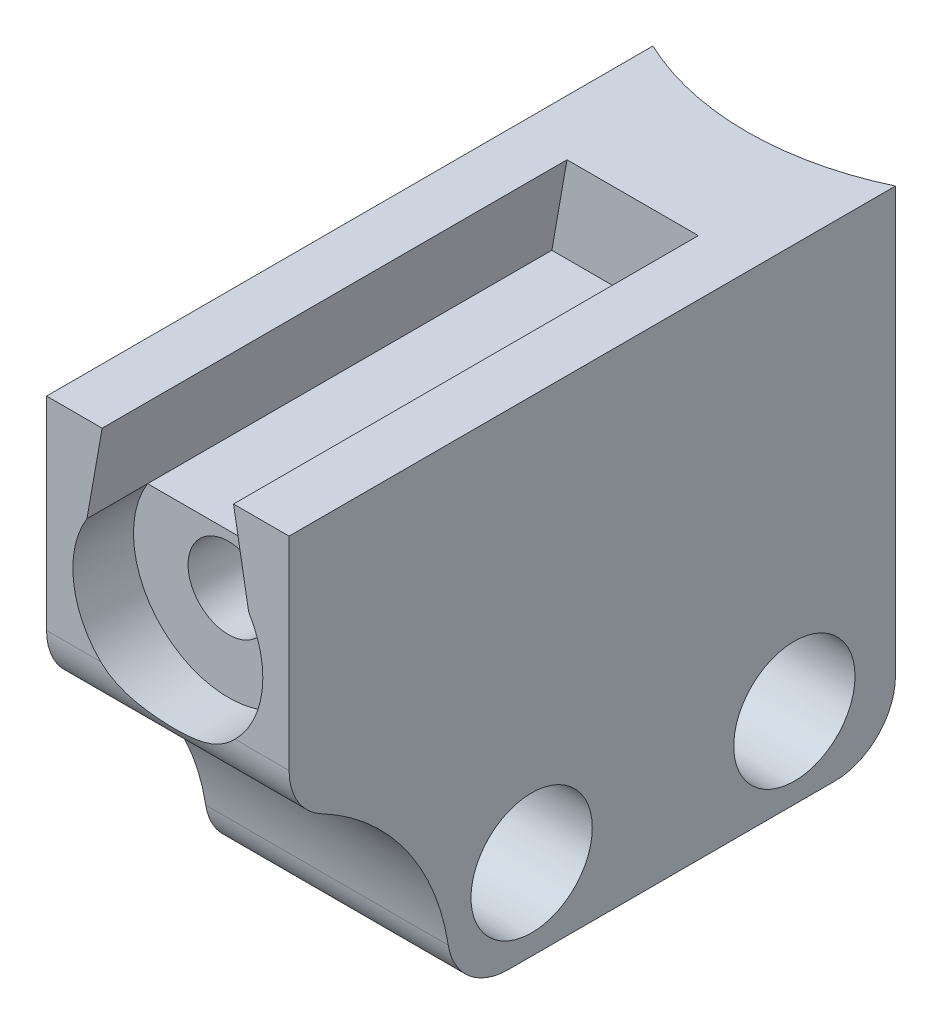
ISO-10303-21;
HEADER;
FILE_DESCRIPTION(('STEP AP214'),'2;1');
FILE_NAME('part.step','',(''),(''),'','','');
FILE_SCHEMA(('AUTOMOTIVE_DESIGN { 1 0 10303 214 1 1 1 1 }'));
ENDSEC;
DATA;
#1=APPLICATION_CONTEXT('core data for automotive mechanical design processes');
#2=APPLICATION_PROTOCOL_DEFINITION('international standard','automotive_design',2000,#1);
#3=PRODUCT_CONTEXT('',#1,'mechanical');
#4=PRODUCT('Part','Part','',(#3));
#5=PRODUCT_RELATED_PRODUCT_CATEGORY('part','',(#4));
#6=PRODUCT_DEFINITION_FORMATION('','',#4);
#7=PRODUCT_DEFINITION_CONTEXT('part definition',#1,'design');
#8=PRODUCT_DEFINITION('design','',#6,#7);
#9=PRODUCT_DEFINITION_SHAPE('','',#8);
#10=(LENGTH_UNIT() NAMED_UNIT(*) SI_UNIT(.MILLI.,.METRE.));
#11=(NAMED_UNIT(*) PLANE_ANGLE_UNIT() SI_UNIT($,.RADIAN.));
#12=(NAMED_UNIT(*) SI_UNIT($,.STERADIAN.) SOLID_ANGLE_UNIT());
#13=UNCERTAINTY_MEASURE_WITH_UNIT(LENGTH_MEASURE(1.E-05),#10,'distance_accuracy_value','');
#14=(GEOMETRIC_REPRESENTATION_CONTEXT(3) GLOBAL_UNCERTAINTY_ASSIGNED_CONTEXT((#13)) GLOBAL_UNIT_ASSIGNED_CONTEXT((#10,
#11,#12)) REPRESENTATION_CONTEXT('',''));
#15=CARTESIAN_POINT('',(0.,0.,0.));
#16=DIRECTION('',(0.,0.,1.));
#17=DIRECTION('',(1.,0.,0.));
#18=AXIS2_PLACEMENT_3D('',#15,#16,#17);
#19=CARTESIAN_POINT('',(6.,12.,15.));
#20=DIRECTION('',(0.,-1.,0.));
#21=DIRECTION('',(0.,0.,-1.));
#22=AXIS2_PLACEMENT_3D('',#19,#20,#21);
#23=PLANE('',#22);
#24=CARTESIAN_POINT('',(0.,12.,-27.6491106406735));
#25=DIRECTION('',(0.,1.,0.));
#26=DIRECTION('',(0.,0.,1.));
#27=AXIS2_PLACEMENT_3D('',#24,#25,#26);
#28=CIRCLE('',#27,14.);
#29=CARTESIAN_POINT('',(-6.,12.,-15.));
#30=VERTEX_POINT('',#29);
#31=CARTESIAN_POINT('',(6.,12.,-15.));
#32=VERTEX_POINT('',#31);
#33=EDGE_CURVE('E147',#30,#32,#28,.T.);
#34=ORIENTED_EDGE('',*,*,#33,.F.);
#35=DIRECTION('',(0.,0.,1.));
#36=VECTOR('',#35,1.);
#37=CARTESIAN_POINT('',(-6.,12.,15.));
#38=LINE('',#37,#36);
#39=CARTESIAN_POINT('',(-6.,12.,15.));
#40=VERTEX_POINT('',#39);
#41=EDGE_CURVE('E156',#30,#40,#38,.T.);
#42=ORIENTED_EDGE('',*,*,#41,.T.);
#43=DIRECTION('',(-1.,0.,0.));
#44=VECTOR('',#43,1.);
#45=CARTESIAN_POINT('',(6.,12.,15.));
#46=LINE('',#45,#44);
#47=CARTESIAN_POINT('',(-3.25,12.,15.));
#48=VERTEX_POINT('',#47);
#49=EDGE_CURVE('E181',#48,#40,#46,.T.);
#50=ORIENTED_EDGE('',*,*,#49,.F.);
#51=DIRECTION('',(0.,0.,1.));
#52=VECTOR('',#51,1.);
#53=CARTESIAN_POINT('',(-3.25,12.,-8.));
#54=LINE('',#53,#52);
#55=CARTESIAN_POINT('',(-3.25,12.,-8.));
#56=VERTEX_POINT('',#55);
#57=EDGE_CURVE('E332',#56,#48,#54,.T.);
#58=ORIENTED_EDGE('',*,*,#57,.F.);
#59=DIRECTION('',(-1.,0.,0.));
#60=VECTOR('',#59,1.);
#61=CARTESIAN_POINT('',(0.,12.,-8.));
#62=LINE('',#61,#60);
#63=CARTESIAN_POINT('',(3.25,12.,-8.));
#64=VERTEX_POINT('',#63);
#65=EDGE_CURVE('E335',#64,#56,#62,.T.);
#66=ORIENTED_EDGE('',*,*,#65,.F.);
#67=DIRECTION('',(0.,0.,1.));
#68=VECTOR('',#67,1.);
#69=CARTESIAN_POINT('',(3.25,12.,-8.));
#70=LINE('',#69,#68);
#71=CARTESIAN_POINT('',(3.25,12.,15.));
#72=VERTEX_POINT('',#71);
#73=EDGE_CURVE('E319',#64,#72,#70,.T.);
#74=ORIENTED_EDGE('',*,*,#73,.T.);
#75=CARTESIAN_POINT('',(6.,12.,15.));
#76=VERTEX_POINT('',#75);
#77=EDGE_CURVE('E177',#76,#72,#46,.T.);
#78=ORIENTED_EDGE('',*,*,#77,.F.);
#79=DIRECTION('',(0.,0.,1.));
#80=VECTOR('',#79,1.);
#81=CARTESIAN_POINT('',(6.,12.,15.));
#82=LINE('',#81,#80);
#83=EDGE_CURVE('E164',#32,#76,#82,.T.);
#84=ORIENTED_EDGE('',*,*,#83,.F.);
#85=EDGE_LOOP('',(#34,#42,#50,#58,#66,#74,#78,#84));
#86=FACE_BOUND('',#85,.T.);
#87=ADVANCED_FACE('F39',(#86),#23,.F.);
#88=CARTESIAN_POINT('',(6.,12.,15.));
#89=DIRECTION('',(0.,0.,-1.));
#90=DIRECTION('',(0.,1.,0.));
#91=AXIS2_PLACEMENT_3D('',#88,#89,#90);
#92=PLANE('',#91);
#93=DIRECTION('',(-0.173648177666928,0.984807753012209,0.));
#94=VECTOR('',#93,1.);
#95=CARTESIAN_POINT('',(5.20412136873109,0.917627008188741,15.));
#96=LINE('',#95,#94);
#97=CARTESIAN_POINT('',(4.,7.74653863528664,15.));
#98=VERTEX_POINT('',#97);
#99=EDGE_CURVE('E501',#98,#72,#96,.T.);
#100=ORIENTED_EDGE('',*,*,#99,.F.);
#101=CARTESIAN_POINT('',(0.,5.27874609943603,15.));
#102=DIRECTION('',(0.,0.,1.));
#103=DIRECTION('',(1.,0.,0.));
#104=AXIS2_PLACEMENT_3D('',#101,#102,#103);
#105=CIRCLE('',#104,4.7);
#106=CARTESIAN_POINT('',(3.32420063272804,1.95614318103448,15.));
#107=VERTEX_POINT('',#106);
#108=EDGE_CURVE('E249',#107,#98,#105,.T.);
#109=ORIENTED_EDGE('',*,*,#108,.F.);
#110=DIRECTION('',(-1.,0.,0.));
#111=VECTOR('',#110,1.);
#112=CARTESIAN_POINT('',(6.,1.95614318103448,15.));
#113=LINE('',#112,#111);
#114=CARTESIAN_POINT('',(6.,1.95614318103449,15.));
#115=VERTEX_POINT('',#114);
#116=EDGE_CURVE('E206',#107,#115,#113,.F.);
#117=ORIENTED_EDGE('',*,*,#116,.T.);
#118=DIRECTION('',(0.,-1.,0.));
#119=VECTOR('',#118,1.);
#120=CARTESIAN_POINT('',(6.,12.,15.));
#121=LINE('',#120,#119);
#122=EDGE_CURVE('E175',#76,#115,#121,.T.);
#123=ORIENTED_EDGE('',*,*,#122,.F.);
#124=ORIENTED_EDGE('',*,*,#77,.T.);
#125=EDGE_LOOP('',(#100,#109,#117,#123,#124));
#126=FACE_BOUND('',#125,.T.);
#127=ADVANCED_FACE('F238',(#126),#92,.F.);
#128=CARTESIAN_POINT('',(0.,5.27874609943603,-15.));
#129=DIRECTION('',(0.,0.,1.));
#130=DIRECTION('',(1.,0.,0.));
#131=AXIS2_PLACEMENT_3D('',#128,#129,#130);
#132=CYLINDRICAL_SURFACE('',#131,2.);
#133=CARTESIAN_POINT('',(2.,5.27874609943603,-13.7927041801225));
#134=CARTESIAN_POINT('',(1.99999534115949,5.16702192819631,-13.792702383547));
#135=CARTESIAN_POINT('',(1.99060664506871,5.05523138666387,-13.7913383209474));
#136=CARTESIAN_POINT('',(1.95330740137887,4.83477146301273,-13.7860326493668));
#137=CARTESIAN_POINT('',(1.92537839621705,4.72610530392088,-13.7820884718432));
#138=CARTESIAN_POINT('',(1.85184738836467,4.51511739940718,-13.7720782142411));
#139=CARTESIAN_POINT('',(1.80625847122079,4.41279102133551,-13.7660137055976));
#140=CARTESIAN_POINT('',(1.69873175889211,4.21725636996797,-13.7524479746925));
#141=CARTESIAN_POINT('',(1.63679637900725,4.12404675239574,-13.7449469647284));
#142=CARTESIAN_POINT('',(1.49785346840196,3.9486978035887,-13.729292388118));
#143=CARTESIAN_POINT('',(1.42075056427329,3.86663438557014,-13.7211348959462));
#144=CARTESIAN_POINT('',(1.25386707896715,3.71656454219545,-13.7051216094891));
#145=CARTESIAN_POINT('',(1.16408582185113,3.64855886679576,-13.6972658313179));
#146=CARTESIAN_POINT('',(0.973910384020492,3.52825700167635,-13.6827002704446));
#147=CARTESIAN_POINT('',(0.873471766216093,3.4760303849176,-13.6759956177388));
#148=CARTESIAN_POINT('',(0.665136745963097,3.38921536410821,-13.6645311261444));
#149=CARTESIAN_POINT('',(0.55724070203933,3.35462611278864,-13.6597711938371));
#150=CARTESIAN_POINT('',(0.337834063540952,3.30429689247176,-13.6527601405837));
#151=CARTESIAN_POINT('',(0.226353125069879,3.28843002946979,-13.6504921374924));
#152=CARTESIAN_POINT('',(0.00228956527839985,3.27560220086943,-13.6486626858352));
#153=CARTESIAN_POINT('',(-0.110292999940578,3.27864027746992,-13.6491011001512));
#154=CARTESIAN_POINT('',(-0.33249899218587,3.30343547765184,-13.6526215460409));
#155=CARTESIAN_POINT('',(-0.442137999771035,3.32505609831854,-13.6556842993492));
#156=CARTESIAN_POINT('',(-0.656215595128694,3.38618865913524,-13.6640877865472));
#157=CARTESIAN_POINT('',(-0.760654059261883,3.42570102442383,-13.6694285745666));
#158=CARTESIAN_POINT('',(-0.961781966767737,3.5216368442196,-13.6818212369637));
#159=CARTESIAN_POINT('',(-1.05844339279107,3.57811825055487,-13.6888789589564));
#160=CARTESIAN_POINT('',(-1.24096782013765,3.70634659217629,-13.7039179737112));
#161=CARTESIAN_POINT('',(-1.32683017541183,3.77809444007925,-13.711899321674));
#162=CARTESIAN_POINT('',(-1.48612299106386,3.93558070111202,-13.7279785912355));
#163=CARTESIAN_POINT('',(-1.55943569332184,4.02143823218522,-13.7360769175612));
#164=CARTESIAN_POINT('',(-1.69062989590123,4.20430062086551,-13.7514077019169));
#165=CARTESIAN_POINT('',(-1.74851131716178,4.30130553558164,-13.7586401555105));
#166=CARTESIAN_POINT('',(-1.84721301520795,4.50382638934221,-13.7714201038443));
#167=CARTESIAN_POINT('',(-1.88802200251778,4.60934790531863,-13.7769664829749));
#168=CARTESIAN_POINT('',(-1.9513062370832,4.82584367926192,-13.785725982584));
#169=CARTESIAN_POINT('',(-1.97378265080302,4.93681758982759,-13.7889392515123));
#170=CARTESIAN_POINT('',(-1.99960390688194,5.16002263686607,-13.7926408331003));
#171=CARTESIAN_POINT('',(-2.00311531104472,5.27223412543161,-13.7931528686425));
#172=CARTESIAN_POINT('',(-1.9913480824712,5.49564390446118,-13.7914569153464));
#173=CARTESIAN_POINT('',(-1.9760699768337,5.60684222325932,-13.7892490028104));
#174=CARTESIAN_POINT('',(-1.92729837855201,5.82455827946448,-13.7823836754219));
#175=CARTESIAN_POINT('',(-1.8938871584442,5.93109482650137,-13.777737327221));
#176=CARTESIAN_POINT('',(-1.80988306171463,6.13705489689253,-13.7665277285518));
#177=CARTESIAN_POINT('',(-1.75928940970141,6.23647809899775,-13.7599643915774));
#178=CARTESIAN_POINT('',(-1.64195360331225,6.42613797915752,-13.7456041565393));
#179=CARTESIAN_POINT('',(-1.57510320027125,6.51630706064839,-13.7377991161505));
#180=CARTESIAN_POINT('',(-1.42730277821365,6.68420582306154,-13.7218597320143));
#181=CARTESIAN_POINT('',(-1.34635203820216,6.76193486749516,-13.7137253714441));
#182=CARTESIAN_POINT('',(-1.17191708628535,6.90334131786983,-13.6979701165344));
#183=CARTESIAN_POINT('',(-1.07834317212433,6.96690862175555,-13.690353545055));
#184=CARTESIAN_POINT('',(-0.881748704771192,7.07742166257175,-13.6765584250755));
#185=CARTESIAN_POINT('',(-0.778728390176453,7.12436781917398,-13.6703798402686));
#186=CARTESIAN_POINT('',(-0.56651592459393,7.20012821375175,-13.6601758622291));
#187=CARTESIAN_POINT('',(-0.457345999123926,7.22900368806352,-13.6561432041013));
#188=CARTESIAN_POINT('',(-0.235645259045783,7.26800156654264,-13.6506550495083));
#189=CARTESIAN_POINT('',(-0.123114645314276,7.27812508928988,-13.6491993993212));
#190=CARTESIAN_POINT('',(0.101043130627158,7.2793063383805,-13.6490305639544));
#191=CARTESIAN_POINT('',(0.212669421750585,7.27053291845447,-13.6502930904496));
#192=CARTESIAN_POINT('',(0.432842633479873,7.234529949393,-13.6553699979231));
#193=CARTESIAN_POINT('',(0.541389561355443,7.20730044383216,-13.6591843728765));
#194=CARTESIAN_POINT('',(0.752283714497252,7.13521612200783,-13.668938420131));
#195=CARTESIAN_POINT('',(0.854634630206986,7.09037191895129,-13.6748768124769));
#196=CARTESIAN_POINT('',(1.05038570585148,6.984348950234,-13.6882250396506));
#197=CARTESIAN_POINT('',(1.14378562996655,6.92316975437792,-13.6956349132297));
#198=CARTESIAN_POINT('',(1.31984194960265,6.78559838421266,-13.7111801660389));
#199=CARTESIAN_POINT('',(1.40240016631986,6.70908119260353,-13.7193211820832));
#200=CARTESIAN_POINT('',(1.55356716727243,6.54326853920073,-13.7353684064114));
#201=CARTESIAN_POINT('',(1.6221726663073,6.4539700764395,-13.7432745590229));
#202=CARTESIAN_POINT('',(1.74379523475593,6.26460066110038,-13.7579997621562));
#203=CARTESIAN_POINT('',(1.79673154300995,6.16447740902491,-13.7648131004009));
#204=CARTESIAN_POINT('',(1.88495902507096,5.95671380283151,-13.7765143593141));
#205=CARTESIAN_POINT('',(1.92026877922144,5.84908150111884,-13.7814043062919));
#206=CARTESIAN_POINT('',(1.96409255165575,5.66390967360549,-13.7875577184963));
#207=CARTESIAN_POINT('',(1.97753762529532,5.58752176402547,-13.7894776007796));
#208=CARTESIAN_POINT('',(1.99549291508544,5.4336819024702,-13.7920514475105));
#209=CARTESIAN_POINT('',(2.00000323103726,5.35622996238991,-13.7927054260983));
#210=CARTESIAN_POINT('',(2.,5.27874609943603,-13.7927041801225));
#211=B_SPLINE_CURVE_WITH_KNOTS('',3,(#133,#134,#135,#136,#137,#138,#139,#140,#141,#142,#143,
#144,#145,#146,#147,#148,#149,#150,#151,#152,#153,#154,#155,#156,#157,#158,#159,#160,#161,#162,
#163,#164,#165,#166,#167,#168,#169,#170,#171,#172,#173,#174,#175,#176,#177,#178,#179,#180,#181,
#182,#183,#184,#185,#186,#187,#188,#189,#190,#191,#192,#193,#194,#195,#196,#197,#198,#199,#200,
#201,#202,#203,#204,#205,#206,#207,#208,#209,#210),.UNSPECIFIED.,.T.,.F.,(4,2,2,2,2,2,2,2,2,2,2,
2,2,2,2,2,2,2,2,2,2,2,2,2,2,2,2,2,2,2,2,2,2,2,2,2,2,2,4),(0.,0.334889349408973,
0.670112594526281,1.00508792139358,1.34001378108308,1.6771171564902,2.01423851114537,
2.35282530676003,2.6913958357102,3.02765822138618,3.36390357078099,3.69769984907442,
4.03150405935711,4.36646147641387,4.70143892261039,5.03940517986243,5.37737316862278,
5.7155642933107,6.05373389790875,6.3889286108256,6.72411392079905,7.05779100804298,
7.39148315513125,7.72746121011463,8.06345644976601,8.40197921522166,8.74049343261658,
9.07785422138908,9.41519488547502,9.74953375304065,10.083871831239,10.4180087723112,
10.7521545140199,11.0891434930866,11.426211725383,11.7649881551453,12.103406718889,
12.3356645196522,12.5679197260806),.UNSPECIFIED.);
#212=CARTESIAN_POINT('',(2.,5.27874609943603,-13.7927041801225));
#213=VERTEX_POINT('',#212);
#214=EDGE_CURVE('E167',#213,#213,#211,.T.);
#215=ORIENTED_EDGE('',*,*,#214,.T.);
#216=EDGE_LOOP('',(#215));
#217=FACE_BOUND('',#216,.T.);
#218=CARTESIAN_POINT('',(0.,5.27874609943603,12.));
#219=DIRECTION('',(0.,0.,1.));
#220=DIRECTION('',(1.,0.,0.));
#221=AXIS2_PLACEMENT_3D('',#218,#219,#220);
#222=CIRCLE('',#221,2.);
#223=CARTESIAN_POINT('',(2.,5.27874609943603,12.));
#224=VERTEX_POINT('',#223);
#225=EDGE_CURVE('E509',#224,#224,#222,.T.);
#226=ORIENTED_EDGE('',*,*,#225,.T.);
#227=EDGE_LOOP('',(#226));
#228=FACE_BOUND('',#227,.T.);
#229=ADVANCED_FACE('F234',(#217,#228),#132,.F.);
#230=CARTESIAN_POINT('',(-6.,1.95614318103449,15.));
#231=VERTEX_POINT('',#230);
#232=CARTESIAN_POINT('',(-3.32420063272804,1.95614318103448,15.));
#233=VERTEX_POINT('',#232);
#234=EDGE_CURVE('E210',#231,#233,#113,.F.);
#235=ORIENTED_EDGE('',*,*,#234,.T.);
#236=CARTESIAN_POINT('',(-4.,7.74653863528664,15.));
#237=VERTEX_POINT('',#236);
#238=EDGE_CURVE('E61',#237,#233,#105,.T.);
#239=ORIENTED_EDGE('',*,*,#238,.F.);
#240=DIRECTION('',(-0.173648177666927,-0.984807753012209,0.));
#241=VECTOR('',#240,1.);
#242=CARTESIAN_POINT('',(-5.20412136873108,0.917627008188738,15.));
#243=LINE('',#242,#241);
#244=EDGE_CURVE('E328',#48,#237,#243,.T.);
#245=ORIENTED_EDGE('',*,*,#244,.F.);
#246=ORIENTED_EDGE('',*,*,#49,.T.);
#247=DIRECTION('',(0.,-1.,0.));
#248=VECTOR('',#247,1.);
#249=CARTESIAN_POINT('',(-6.,12.,15.));
#250=LINE('',#249,#248);
#251=EDGE_CURVE('E171',#40,#231,#250,.T.);
#252=ORIENTED_EDGE('',*,*,#251,.T.);
#253=EDGE_LOOP('',(#235,#239,#245,#246,#252));
#254=FACE_BOUND('',#253,.T.);
#255=ADVANCED_FACE('F239',(#254),#92,.F.);
#256=CARTESIAN_POINT('',(6.,-11.3204973740894,18.9807460611341));
#257=DIRECTION('',(-1.,0.,0.));
#258=DIRECTION('',(0.,0.,1.));
#259=AXIS2_PLACEMENT_3D('',#256,#257,#258);
#260=PLANE('',#259);
#261=DIRECTION('',(0.,0.,-1.));
#262=VECTOR('',#261,1.);
#263=CARTESIAN_POINT('',(6.,-12.,7.));
#264=LINE('',#263,#262);
#265=CARTESIAN_POINT('',(6.,-12.,4.16132326748779));
#266=VERTEX_POINT('',#265);
#267=CARTESIAN_POINT('',(6.,-12.,-12.));
#268=VERTEX_POINT('',#267);
#269=EDGE_CURVE('E299',#266,#268,#264,.T.);
#270=ORIENTED_EDGE('',*,*,#269,.T.);
#271=CARTESIAN_POINT('',(6.,-9.,-12.));
#272=DIRECTION('',(-1.,0.,0.));
#273=DIRECTION('',(0.,0.,1.));
#274=AXIS2_PLACEMENT_3D('',#271,#272,#273);
#275=CIRCLE('',#274,3.);
#276=CARTESIAN_POINT('',(6.,-8.99999999999999,-15.));
#277=VERTEX_POINT('',#276);
#278=EDGE_CURVE('E196',#268,#277,#275,.F.);
#279=ORIENTED_EDGE('',*,*,#278,.T.);
#280=DIRECTION('',(0.,1.,0.));
#281=VECTOR('',#280,1.);
#282=CARTESIAN_POINT('',(6.,12.,-15.));
#283=LINE('',#282,#281);
#284=EDGE_CURVE('E308',#277,#32,#283,.T.);
#285=ORIENTED_EDGE('',*,*,#284,.T.);
#286=ORIENTED_EDGE('',*,*,#83,.T.);
#287=ORIENTED_EDGE('',*,*,#122,.T.);
#288=CARTESIAN_POINT('',(6.,1.95614318103448,12.));
#289=DIRECTION('',(-1.,0.,0.));
#290=DIRECTION('',(0.,0.,1.));
#291=AXIS2_PLACEMENT_3D('',#288,#289,#290);
#292=CIRCLE('',#291,3.);
#293=CARTESIAN_POINT('',(6.,-0.699184929990297,13.3961492122268));
#294=VERTEX_POINT('',#293);
#295=EDGE_CURVE('E192',#115,#294,#292,.F.);
#296=ORIENTED_EDGE('',*,*,#295,.T.);
#297=CARTESIAN_POINT('',(6.,-11.3204973740894,18.9807460611341));
#298=DIRECTION('',(-1.,0.,0.));
#299=DIRECTION('',(0.,0.,1.));
#300=AXIS2_PLACEMENT_3D('',#297,#298,#299);
#301=CIRCLE('',#300,12.);
#302=CARTESIAN_POINT('',(6.,-9.46409947481788,7.12520782621705));
#303=VERTEX_POINT('',#302);
#304=EDGE_CURVE('E174',#294,#303,#301,.T.);
#305=ORIENTED_EDGE('',*,*,#304,.T.);
#306=CARTESIAN_POINT('',(6.,-9.,4.16132326748779));
#307=DIRECTION('',(-1.,0.,0.));
#308=DIRECTION('',(0.,0.,1.));
#309=AXIS2_PLACEMENT_3D('',#306,#307,#308);
#310=CIRCLE('',#309,3.);
#311=EDGE_CURVE('E198',#303,#266,#310,.F.);
#312=ORIENTED_EDGE('',*,*,#311,.T.);
#313=EDGE_LOOP('',(#270,#279,#285,#286,#287,#296,#305,#312));
#314=FACE_BOUND('',#313,.T.);
#315=CARTESIAN_POINT('',(6.,-8.,3.));
#316=DIRECTION('',(1.,0.,0.));
#317=DIRECTION('',(0.,0.,-1.));
#318=AXIS2_PLACEMENT_3D('',#315,#316,#317);
#319=CIRCLE('',#318,3.);
#320=CARTESIAN_POINT('',(6.,-8.,0.));
#321=VERTEX_POINT('',#320);
#322=EDGE_CURVE('E314',#321,#321,#319,.T.);
#323=ORIENTED_EDGE('',*,*,#322,.F.);
#324=EDGE_LOOP('',(#323));
#325=FACE_BOUND('',#324,.T.);
#326=CARTESIAN_POINT('',(6.,-7.99999999999999,-10.));
#327=DIRECTION('',(1.,0.,0.));
#328=DIRECTION('',(0.,0.,-1.));
#329=AXIS2_PLACEMENT_3D('',#326,#327,#328);
#330=CIRCLE('',#329,3.);
#331=CARTESIAN_POINT('',(6.,-7.99999999999999,-13.));
#332=VERTEX_POINT('',#331);
#333=EDGE_CURVE('E347',#332,#332,#330,.T.);
#334=ORIENTED_EDGE('',*,*,#333,.F.);
#335=EDGE_LOOP('',(#334));
#336=FACE_BOUND('',#335,.T.);
#337=ADVANCED_FACE('F278',(#314,#325,#336),#260,.F.);
#338=CARTESIAN_POINT('',(-6.,-11.3204973740894,18.9807460611341));
#339=DIRECTION('',(-1.,0.,0.));
#340=DIRECTION('',(0.,0.,1.));
#341=AXIS2_PLACEMENT_3D('',#338,#339,#340);
#342=PLANE('',#341);
#343=CARTESIAN_POINT('',(-6.,-8.,3.));
#344=DIRECTION('',(1.,0.,0.));
#345=DIRECTION('',(0.,0.,-1.));
#346=AXIS2_PLACEMENT_3D('',#343,#344,#345);
#347=CIRCLE('',#346,3.);
#348=CARTESIAN_POINT('',(-6.,-8.,0.));
#349=VERTEX_POINT('',#348);
#350=EDGE_CURVE('E349',#349,#349,#347,.T.);
#351=ORIENTED_EDGE('',*,*,#350,.T.);
#352=EDGE_LOOP('',(#351));
#353=FACE_BOUND('',#352,.T.);
#354=DIRECTION('',(0.,1.,0.));
#355=VECTOR('',#354,1.);
#356=CARTESIAN_POINT('',(-6.,12.,-15.));
#357=LINE('',#356,#355);
#358=CARTESIAN_POINT('',(-6.,-9.,-15.));
#359=VERTEX_POINT('',#358);
#360=EDGE_CURVE('E148',#359,#30,#357,.T.);
#361=ORIENTED_EDGE('',*,*,#360,.F.);
#362=CARTESIAN_POINT('',(-6.,-9.,-12.));
#363=DIRECTION('',(-1.,0.,0.));
#364=DIRECTION('',(0.,0.,1.));
#365=AXIS2_PLACEMENT_3D('',#362,#363,#364);
#366=CIRCLE('',#365,3.);
#367=CARTESIAN_POINT('',(-6.,-12.,-12.));
#368=VERTEX_POINT('',#367);
#369=EDGE_CURVE('E190',#359,#368,#366,.T.);
#370=ORIENTED_EDGE('',*,*,#369,.T.);
#371=DIRECTION('',(0.,0.,-1.));
#372=VECTOR('',#371,1.);
#373=CARTESIAN_POINT('',(-6.,-12.,7.));
#374=LINE('',#373,#372);
#375=CARTESIAN_POINT('',(-6.,-12.,4.16132326748779));
#376=VERTEX_POINT('',#375);
#377=EDGE_CURVE('E160',#376,#368,#374,.T.);
#378=ORIENTED_EDGE('',*,*,#377,.F.);
#379=CARTESIAN_POINT('',(-6.,-9.,4.16132326748779));
#380=DIRECTION('',(-1.,0.,0.));
#381=DIRECTION('',(0.,0.,1.));
#382=AXIS2_PLACEMENT_3D('',#379,#380,#381);
#383=CIRCLE('',#382,3.);
#384=CARTESIAN_POINT('',(-6.,-9.46409947481788,7.12520782621705));
#385=VERTEX_POINT('',#384);
#386=EDGE_CURVE('E183',#376,#385,#383,.T.);
#387=ORIENTED_EDGE('',*,*,#386,.T.);
#388=CARTESIAN_POINT('',(-6.,-11.3204973740894,18.9807460611341));
#389=DIRECTION('',(-1.,0.,0.));
#390=DIRECTION('',(0.,0.,1.));
#391=AXIS2_PLACEMENT_3D('',#388,#389,#390);
#392=CIRCLE('',#391,12.);
#393=CARTESIAN_POINT('',(-6.,-0.699184929990297,13.3961492122268));
#394=VERTEX_POINT('',#393);
#395=EDGE_CURVE('E311',#394,#385,#392,.T.);
#396=ORIENTED_EDGE('',*,*,#395,.F.);
#397=CARTESIAN_POINT('',(-6.,1.95614318103448,12.));
#398=DIRECTION('',(-1.,0.,0.));
#399=DIRECTION('',(0.,0.,1.));
#400=AXIS2_PLACEMENT_3D('',#397,#398,#399);
#401=CIRCLE('',#400,3.);
#402=EDGE_CURVE('E185',#394,#231,#401,.T.);
#403=ORIENTED_EDGE('',*,*,#402,.T.);
#404=ORIENTED_EDGE('',*,*,#251,.F.);
#405=ORIENTED_EDGE('',*,*,#41,.F.);
#406=EDGE_LOOP('',(#361,#370,#378,#387,#396,#403,#404,#405));
#407=FACE_BOUND('',#406,.T.);
#408=CARTESIAN_POINT('',(-6.,-7.99999999999999,-10.));
#409=DIRECTION('',(1.,0.,0.));
#410=DIRECTION('',(0.,0.,-1.));
#411=AXIS2_PLACEMENT_3D('',#408,#409,#410);
#412=CIRCLE('',#411,3.);
#413=CARTESIAN_POINT('',(-6.,-7.99999999999999,-13.));
#414=VERTEX_POINT('',#413);
#415=EDGE_CURVE('E340',#414,#414,#412,.T.);
#416=ORIENTED_EDGE('',*,*,#415,.T.);
#417=EDGE_LOOP('',(#416));
#418=FACE_BOUND('',#417,.T.);
#419=ADVANCED_FACE('F169',(#353,#407,#418),#342,.T.);
#420=CARTESIAN_POINT('',(6.,-11.3204973740894,18.9807460611341));
#421=DIRECTION('',(-1.,0.,0.));
#422=DIRECTION('',(0.,0.,1.));
#423=AXIS2_PLACEMENT_3D('',#420,#421,#422);
#424=CYLINDRICAL_SURFACE('',#423,12.);
#425=ORIENTED_EDGE('',*,*,#395,.T.);
#426=DIRECTION('',(-1.,0.,0.));
#427=VECTOR('',#426,1.);
#428=CARTESIAN_POINT('',(6.,-9.46409947481788,7.12520782621705));
#429=LINE('',#428,#427);
#430=EDGE_CURVE('E204',#385,#303,#429,.F.);
#431=ORIENTED_EDGE('',*,*,#430,.T.);
#432=ORIENTED_EDGE('',*,*,#304,.F.);
#433=DIRECTION('',(-1.,0.,0.));
#434=VECTOR('',#433,1.);
#435=CARTESIAN_POINT('',(6.,-0.699184929990295,13.3961492122268));
#436=LINE('',#435,#434);
#437=EDGE_CURVE('E203',#294,#394,#436,.T.);
#438=ORIENTED_EDGE('',*,*,#437,.T.);
#439=EDGE_LOOP('',(#425,#431,#432,#438));
#440=FACE_BOUND('',#439,.T.);
#441=ADVANCED_FACE('F274',(#440),#424,.F.);
#442=CARTESIAN_POINT('',(6.,-12.,7.));
#443=DIRECTION('',(0.,1.,0.));
#444=DIRECTION('',(0.,0.,1.));
#445=AXIS2_PLACEMENT_3D('',#442,#443,#444);
#446=PLANE('',#445);
#447=ORIENTED_EDGE('',*,*,#377,.T.);
#448=DIRECTION('',(-1.,0.,0.));
#449=VECTOR('',#448,1.);
#450=CARTESIAN_POINT('',(6.,-12.,-12.));
#451=LINE('',#450,#449);
#452=EDGE_CURVE('E195',#368,#268,#451,.F.);
#453=ORIENTED_EDGE('',*,*,#452,.T.);
#454=ORIENTED_EDGE('',*,*,#269,.F.);
#455=DIRECTION('',(-1.,0.,0.));
#456=VECTOR('',#455,1.);
#457=CARTESIAN_POINT('',(6.,-12.,4.16132326748779));
#458=LINE('',#457,#456);
#459=EDGE_CURVE('E188',#266,#376,#458,.T.);
#460=ORIENTED_EDGE('',*,*,#459,.T.);
#461=EDGE_LOOP('',(#447,#453,#454,#460));
#462=FACE_BOUND('',#461,.T.);
#463=ADVANCED_FACE('F271',(#462),#446,.F.);
#464=CARTESIAN_POINT('',(6.,-8.,3.));
#465=DIRECTION('',(-1.,0.,0.));
#466=DIRECTION('',(0.,0.,1.));
#467=AXIS2_PLACEMENT_3D('',#464,#465,#466);
#468=CYLINDRICAL_SURFACE('',#467,3.);
#469=ORIENTED_EDGE('',*,*,#322,.T.);
#470=EDGE_LOOP('',(#469));
#471=FACE_BOUND('',#470,.T.);
#472=ORIENTED_EDGE('',*,*,#350,.F.);
#473=EDGE_LOOP('',(#472));
#474=FACE_BOUND('',#473,.T.);
#475=ADVANCED_FACE('F273',(#471,#474),#468,.F.);
#476=CARTESIAN_POINT('',(6.,-7.99999999999999,-10.));
#477=DIRECTION('',(-1.,0.,0.));
#478=DIRECTION('',(0.,0.,1.));
#479=AXIS2_PLACEMENT_3D('',#476,#477,#478);
#480=CYLINDRICAL_SURFACE('',#479,3.);
#481=ORIENTED_EDGE('',*,*,#333,.T.);
#482=EDGE_LOOP('',(#481));
#483=FACE_BOUND('',#482,.T.);
#484=ORIENTED_EDGE('',*,*,#415,.F.);
#485=EDGE_LOOP('',(#484));
#486=FACE_BOUND('',#485,.T.);
#487=ADVANCED_FACE('F245',(#483,#486),#480,.F.);
#488=CARTESIAN_POINT('',(6.,-9.,-12.));
#489=DIRECTION('',(-1.,0.,0.));
#490=DIRECTION('',(0.,0.,1.));
#491=AXIS2_PLACEMENT_3D('',#488,#489,#490);
#492=CYLINDRICAL_SURFACE('',#491,3.);
#493=CARTESIAN_POINT('',(6.,-9.,-15.));
#494=CARTESIAN_POINT('',(6.00000657782793,-9.03868631510229,-15.0000043243056));
#495=CARTESIAN_POINT('',(5.99842111634691,-9.07735100505736,-14.9992509688993));
#496=CARTESIAN_POINT('',(5.99214002263667,-9.15434069491984,-14.9962739425547));
#497=CARTESIAN_POINT('',(5.98744679231226,-9.19266593401617,-14.9940514071054));
#498=CARTESIAN_POINT('',(5.96892549487739,-9.30608565077802,-14.9852991473146));
#499=CARTESIAN_POINT('',(5.9506527955879,-9.38033762845916,-14.9766829957419));
#500=CARTESIAN_POINT('',(5.90364706701082,-9.52436284752305,-14.9547179317865));
#501=CARTESIAN_POINT('',(5.87494320654239,-9.59414794587893,-14.941382219478));
#502=CARTESIAN_POINT('',(5.80873973995462,-9.72865689914257,-14.9109837445074));
#503=CARTESIAN_POINT('',(5.77122085363034,-9.79336923913826,-14.8939128178982));
#504=CARTESIAN_POINT('',(5.66320698550599,-9.95627173712363,-14.8454622567116));
#505=CARTESIAN_POINT('',(5.58682433368247,-10.0498819617454,-14.8118415844091));
#506=CARTESIAN_POINT('',(5.42102147661566,-10.2231215110567,-14.7409464939748));
#507=CARTESIAN_POINT('',(5.33156632801313,-10.3027120619508,-14.7036623736556));
#508=CARTESIAN_POINT('',(5.15773522555032,-10.4385442889378,-14.6335347897429));
#509=CARTESIAN_POINT('',(5.07460188449943,-10.4964976979828,-14.6008615646657));
#510=CARTESIAN_POINT('',(4.90338040950714,-10.6046624269818,-14.5355579944975));
#511=CARTESIAN_POINT('',(4.81528866502637,-10.6548680030379,-14.5029276988317));
#512=CARTESIAN_POINT('',(4.63524768619269,-10.7485958461999,-14.4383711009922));
#513=CARTESIAN_POINT('',(4.54329362635488,-10.7921094159535,-14.4064457603835));
#514=CARTESIAN_POINT('',(4.35642562129561,-10.8732915129647,-14.343800130581));
#515=CARTESIAN_POINT('',(4.26151056551703,-10.9109578146964,-14.3130803035248));
#516=CARTESIAN_POINT('',(3.97865275175083,-11.0143926683122,-14.2249347050245));
#517=CARTESIAN_POINT('',(3.78745414397986,-11.0731338912596,-14.1696668310473));
#518=CARTESIAN_POINT('',(3.39916477809127,-11.1759287383275,-14.0665421695541));
#519=CARTESIAN_POINT('',(3.20206883798112,-11.2199690055406,-14.0186921427247));
#520=CARTESIAN_POINT('',(2.80330945357182,-11.2965536316602,-13.9311209235249));
#521=CARTESIAN_POINT('',(2.60163466634047,-11.3290651200244,-13.8914231078312));
#522=CARTESIAN_POINT('',(2.19554722884277,-11.3846771347174,-13.8208045198476));
#523=CARTESIAN_POINT('',(1.9911352265317,-11.4077798489976,-13.7898817074934));
#524=CARTESIAN_POINT('',(1.62667082591943,-11.4418337151343,-13.7430078911202));
#525=CARTESIAN_POINT('',(1.46698945687369,-11.4543495254939,-13.7252536183258));
#526=CARTESIAN_POINT('',(1.14682323303139,-11.4751796813055,-13.6952349140729));
#527=CARTESIAN_POINT('',(0.986338306497511,-11.483493644633,-13.6829709819288));
#528=CARTESIAN_POINT('',(0.664806153247929,-11.4962597975441,-13.6639762321703));
#529=CARTESIAN_POINT('',(0.503758674679957,-11.5007099487641,-13.6572483352027));
#530=CARTESIAN_POINT('',(0.181448324229824,-11.505920920724,-13.6493582844464));
#531=CARTESIAN_POINT('',(0.0201854281892003,-11.5066812854753,-13.6481968185649));
#532=CARTESIAN_POINT('',(-0.301923523702753,-11.504544524537,-13.6514419315474));
#533=CARTESIAN_POINT('',(-0.462769746964359,-11.5016550307639,-13.6558368918464));
#534=CARTESIAN_POINT('',(-0.784084716854307,-11.4921157544757,-13.6701597023822));
#535=CARTESIAN_POINT('',(-0.944553509374959,-11.4854664556809,-13.6800868408705));
#536=CARTESIAN_POINT('',(-1.26474525286675,-11.4681450759342,-13.7054312573551));
#537=CARTESIAN_POINT('',(-1.42446859094762,-11.4574753919377,-13.7208452637762));
#538=CARTESIAN_POINT('',(-1.74291960729599,-11.4316844059775,-13.7571018995331));
#539=CARTESIAN_POINT('',(-1.90164742026585,-11.4165637201463,-13.7779437774664));
#540=CARTESIAN_POINT('',(-2.21076212662499,-11.3820369549809,-13.8239214683532));
#541=CARTESIAN_POINT('',(-2.36120756792406,-11.3628498538588,-13.848826746265));
#542=CARTESIAN_POINT('',(-2.66045578936494,-11.3191306948212,-13.9033803565006));
#543=CARTESIAN_POINT('',(-2.80925865094938,-11.294598903169,-13.9330284525257));
#544=CARTESIAN_POINT('',(-3.10477985577473,-11.239247405298,-13.9968872812604));
#545=CARTESIAN_POINT('',(-3.25149730846459,-11.20842509425,-14.0310999020463));
#546=CARTESIAN_POINT('',(-3.54209281323176,-11.1393066125292,-14.1037796617218));
#547=CARTESIAN_POINT('',(-3.68597139915255,-11.1010118620717,-14.1422459915487));
#548=CARTESIAN_POINT('',(-3.93929073729187,-11.0246492111103,-14.2142532209536));
#549=CARTESIAN_POINT('',(-4.04946041583886,-10.988317133902,-14.2470646589166));
#550=CARTESIAN_POINT('',(-4.26681803220214,-10.9091874617805,-14.3146738174358));
#551=CARTESIAN_POINT('',(-4.37400680319489,-10.8663916954468,-14.3494709745048));
#552=CARTESIAN_POINT('',(-4.58428594516795,-10.7733258147391,-14.420482531944));
#553=CARTESIAN_POINT('',(-4.68738599069198,-10.7230748664395,-14.4566931276757));
#554=CARTESIAN_POINT('',(-4.88844373873733,-10.6137219296142,-14.5298675251663));
#555=CARTESIAN_POINT('',(-4.98640583597537,-10.5546276775738,-14.5668306444066));
#556=CARTESIAN_POINT('',(-5.17276484627337,-10.427824969471,-14.6394137179434));
#557=CARTESIAN_POINT('',(-5.26135406330394,-10.3604078201519,-14.6750420680829));
#558=CARTESIAN_POINT('',(-5.42951260634081,-10.2141647450037,-14.7445129054268));
#559=CARTESIAN_POINT('',(-5.5090857198899,-10.1353436417429,-14.778356139317));
#560=CARTESIAN_POINT('',(-5.64397027703848,-9.97841258485895,-14.8370013609537));
#561=CARTESIAN_POINT('',(-5.70112946958127,-9.9021316828035,-14.8623887646641));
#562=CARTESIAN_POINT('',(-5.80323466559772,-9.74041231786317,-14.9084040161389));
#563=CARTESIAN_POINT('',(-5.84819801067441,-9.65498710131876,-14.9290386156748));
#564=CARTESIAN_POINT('',(-5.91417327061583,-9.49578790878805,-14.9596038530275));
#565=CARTESIAN_POINT('',(-5.93827396964489,-9.4235588329851,-14.9708889664072));
#566=CARTESIAN_POINT('',(-5.97514464420929,-9.27571494122545,-14.9882230790685));
#567=CARTESIAN_POINT('',(-5.9879423621503,-9.20010889618722,-14.9942848976777));
#568=CARTESIAN_POINT('',(-5.99639650256274,-9.10334828112855,-14.9982913337249));
#569=CARTESIAN_POINT('',(-5.99774710398821,-9.08270048784292,-14.9989316100053));
#570=CARTESIAN_POINT('',(-5.99954782677547,-9.04137110263801,-14.9997854398589));
#571=CARTESIAN_POINT('',(-5.99999856736084,-9.02068954376873,-14.9999992868719));
#572=CARTESIAN_POINT('',(-6.00000000000067,-9.00000000000006,-15.));
#573=B_SPLINE_CURVE_WITH_KNOTS('',3,(#493,#494,#495,#496,#497,#498,#499,#500,#501,#502,#503,
#504,#505,#506,#507,#508,#509,#510,#511,#512,#513,#514,#515,#516,#517,#518,#519,#520,#521,#522,
#523,#524,#525,#526,#527,#528,#529,#530,#531,#532,#533,#534,#535,#536,#537,#538,#539,#540,#541,
#542,#543,#544,#545,#546,#547,#548,#549,#550,#551,#552,#553,#554,#555,#556,#557,#558,#559,#560,
#561,#562,#563,#564,#565,#566,#567,#568,#569,#570,#571,#572),.UNSPECIFIED.,.F.,.F.,(4,2,2,2,2,2,
2,2,2,2,2,2,2,2,2,2,2,2,2,2,2,2,2,2,2,2,2,2,2,2,2,2,2,2,2,2,2,2,2,4),(0.,0.115978440825648,
0.231867349719322,0.461534914863908,0.690565137462785,0.920101036004711,1.29418067542737,
1.66927918438644,1.98825534975725,2.30746686542741,2.62708980488816,2.94683409918991,
3.56834306695357,4.19041519435531,4.81424696004498,5.43793357462502,5.92124380067553,
6.40459797202979,6.88820698339983,7.37187575828163,7.85453484564142,8.3371318502864,
8.81944158448502,9.30168458604027,9.76261043610162,10.2235133288779,10.6846074647029,
11.1456140499788,11.5070956943804,11.8684752664076,12.2289413919192,12.5890939907267,
12.9390483454713,13.2888551397755,13.5837736986029,13.8782706798592,14.1082791886236,
14.3377215754368,14.3998110483177,14.4618577806614),.UNSPECIFIED.);
#574=EDGE_CURVE('E11',#277,#359,#573,.T.);
#575=ORIENTED_EDGE('',*,*,#574,.F.);
#576=ORIENTED_EDGE('',*,*,#278,.F.);
#577=ORIENTED_EDGE('',*,*,#452,.F.);
#578=ORIENTED_EDGE('',*,*,#369,.F.);
#579=EDGE_LOOP('',(#575,#576,#577,#578));
#580=FACE_BOUND('',#579,.T.);
#581=ADVANCED_FACE('F285',(#580),#492,.T.);
#582=CARTESIAN_POINT('',(6.,-9.,4.16132326748779));
#583=DIRECTION('',(-1.,0.,0.));
#584=DIRECTION('',(0.,0.,1.));
#585=AXIS2_PLACEMENT_3D('',#582,#583,#584);
#586=CYLINDRICAL_SURFACE('',#585,3.);
#587=ORIENTED_EDGE('',*,*,#311,.F.);
#588=ORIENTED_EDGE('',*,*,#430,.F.);
#589=ORIENTED_EDGE('',*,*,#386,.F.);
#590=ORIENTED_EDGE('',*,*,#459,.F.);
#591=EDGE_LOOP('',(#587,#588,#589,#590));
#592=FACE_BOUND('',#591,.T.);
#593=ADVANCED_FACE('F283',(#592),#586,.T.);
#594=CARTESIAN_POINT('',(6.,1.95614318103448,12.));
#595=DIRECTION('',(-1.,0.,0.));
#596=DIRECTION('',(0.,0.,1.));
#597=AXIS2_PLACEMENT_3D('',#594,#595,#596);
#598=CYLINDRICAL_SURFACE('',#597,3.);
#599=CARTESIAN_POINT('',(-3.32420063272804,1.95614318103448,15.));
#600=CARTESIAN_POINT('',(-3.23367334666596,1.86554611243241,14.9999853492437));
#601=CARTESIAN_POINT('',(-3.13950308055415,1.77876069865677,14.9958987580165));
#602=CARTESIAN_POINT('',(-2.94481283805324,1.61346109581232,14.9815198163408));
#603=CARTESIAN_POINT('',(-2.84430197227962,1.53493545288968,14.9712361962264));
#604=CARTESIAN_POINT('',(-2.63770157408184,1.38661298595758,14.946401708754));
#605=CARTESIAN_POINT('',(-2.53161718609491,1.31680830667448,14.9318547216636));
#606=CARTESIAN_POINT('',(-2.3144403199216,1.18613693643145,14.9002767592043));
#607=CARTESIAN_POINT('',(-2.20334614938681,1.12527329584497,14.8832449400281));
#608=CARTESIAN_POINT('',(-1.87422394149106,0.961894478072764,14.8326816321992));
#609=CARTESIAN_POINT('',(-1.65017850090599,0.871365166648336,14.7981322499798));
#610=CARTESIAN_POINT('',(-1.30528286255755,0.762018820061459,14.752381973286));
#611=CARTESIAN_POINT('',(-1.18882889728054,0.729975249973907,14.7381425582321));
#612=CARTESIAN_POINT('',(-0.953487642734989,0.674895473986771,14.712808442831));
#613=CARTESIAN_POINT('',(-0.834601504091345,0.65185510796749,14.7017122907267));
#614=CARTESIAN_POINT('',(-0.585328534905987,0.613495442549116,14.6828707391035));
#615=CARTESIAN_POINT('',(-0.454794066968243,0.598958446365827,14.6754721277251));
#616=CARTESIAN_POINT('',(-0.192761436169264,0.580864965952596,14.666217328258));
#617=CARTESIAN_POINT('',(-0.0612632591959772,0.577308642841238,14.6643612214943));
#618=CARTESIAN_POINT('',(0.201555291109331,0.581230521402323,14.6663869783556));
#619=CARTESIAN_POINT('',(0.332875611511449,0.588711493719181,14.6702702827206));
#620=CARTESIAN_POINT('',(0.594153771434132,0.614604283728997,14.6833713176185));
#621=CARTESIAN_POINT('',(0.72411162973217,0.633015950572888,14.6925889745346));
#622=CARTESIAN_POINT('',(0.96932069799092,0.678263825407759,14.7143299519096));
#623=CARTESIAN_POINT('',(1.08478898546027,0.704125027826024,14.7264524352389));
#624=CARTESIAN_POINT('',(1.31317851537939,0.76437647448431,14.7533208773751));
#625=CARTESIAN_POINT('',(1.42609863589022,0.798770398657292,14.7680679673265));
#626=CARTESIAN_POINT('',(1.76018106445673,0.914435182632403,14.8145657956628));
#627=CARTESIAN_POINT('',(1.97688790020105,1.00823045487752,14.8485967110232));
#628=CARTESIAN_POINT('',(2.28956621500632,1.17243766574671,14.8963829125116));
#629=CARTESIAN_POINT('',(2.39169637424307,1.23106877066679,14.9117636561675));
#630=CARTESIAN_POINT('',(2.59151475199758,1.35600268130061,14.9400570384531));
#631=CARTESIAN_POINT('',(2.68920443726444,1.42230292776158,14.9529704966426));
#632=CARTESIAN_POINT('',(2.87974482459752,1.56242200155019,14.9748984123525));
#633=CARTESIAN_POINT('',(2.97258820529852,1.6362517335835,14.9839071127704));
#634=CARTESIAN_POINT('',(3.15274415225628,1.79100178589976,14.9964560134675));
#635=CARTESIAN_POINT('',(3.24004967738041,1.87193083314229,14.999989380676));
#636=CARTESIAN_POINT('',(3.32420063272804,1.95614318103448,15.));
#637=B_SPLINE_CURVE_WITH_KNOTS('',3,(#599,#600,#601,#602,#603,#604,#605,#606,#607,#608,#609,
#610,#611,#612,#613,#614,#615,#616,#617,#618,#619,#620,#621,#622,#623,#624,#625,#626,#627,#628,
#629,#630,#631,#632,#633,#634,#635,#636),.UNSPECIFIED.,.F.,.F.,(4,2,2,2,2,2,2,2,2,2,2,2,2,2,2,2,
2,2,4),(0.,0.383876679098064,0.767213815409925,1.15020313841865,1.53332282220381,
2.26222241020588,2.62677782030568,2.99116458015712,3.38524874711378,3.7793386964101,
4.17352758923088,4.5677110421737,4.92416606099022,5.28077507730918,5.99331728155798,
6.34934883348673,6.70526191579883,7.0616979794291,7.41857850860798),.UNSPECIFIED.);
#638=EDGE_CURVE('E53',#233,#107,#637,.T.);
#639=ORIENTED_EDGE('',*,*,#638,.F.);
#640=ORIENTED_EDGE('',*,*,#234,.F.);
#641=ORIENTED_EDGE('',*,*,#402,.F.);
#642=ORIENTED_EDGE('',*,*,#437,.F.);
#643=ORIENTED_EDGE('',*,*,#295,.F.);
#644=ORIENTED_EDGE('',*,*,#116,.F.);
#645=EDGE_LOOP('',(#639,#640,#641,#642,#643,#644));
#646=FACE_BOUND('',#645,.T.);
#647=ADVANCED_FACE('F41',(#646),#598,.T.);
#648=CARTESIAN_POINT('',(0.,7.74653863528664,-8.));
#649=DIRECTION('',(0.,-1.,0.));
#650=DIRECTION('',(1.,0.,0.));
#651=AXIS2_PLACEMENT_3D('',#648,#649,#650);
#652=PLANE('',#651);
#653=DIRECTION('',(0.,0.,1.));
#654=VECTOR('',#653,1.);
#655=CARTESIAN_POINT('',(-4.,7.74653863528664,-8.));
#656=LINE('',#655,#654);
#657=CARTESIAN_POINT('',(-4.,7.74653863528664,-8.));
#658=VERTEX_POINT('',#657);
#659=CARTESIAN_POINT('',(-4.,7.74653863528664,12.));
#660=VERTEX_POINT('',#659);
#661=EDGE_CURVE('E331',#658,#660,#656,.T.);
#662=ORIENTED_EDGE('',*,*,#661,.T.);
#663=DIRECTION('',(1.,0.,0.));
#664=VECTOR('',#663,1.);
#665=CARTESIAN_POINT('',(0.,7.74653863528664,12.));
#666=LINE('',#665,#664);
#667=CARTESIAN_POINT('',(4.,7.74653863528664,12.));
#668=VERTEX_POINT('',#667);
#669=EDGE_CURVE('E514',#660,#668,#666,.T.);
#670=ORIENTED_EDGE('',*,*,#669,.T.);
#671=DIRECTION('',(0.,0.,1.));
#672=VECTOR('',#671,1.);
#673=CARTESIAN_POINT('',(4.,7.74653863528664,-8.));
#674=LINE('',#673,#672);
#675=CARTESIAN_POINT('',(4.,7.74653863528664,-8.));
#676=VERTEX_POINT('',#675);
#677=EDGE_CURVE('E338',#676,#668,#674,.T.);
#678=ORIENTED_EDGE('',*,*,#677,.F.);
#679=DIRECTION('',(1.,0.,0.));
#680=VECTOR('',#679,1.);
#681=CARTESIAN_POINT('',(0.,7.74653863528664,-8.));
#682=LINE('',#681,#680);
#683=EDGE_CURVE('E502',#658,#676,#682,.T.);
#684=ORIENTED_EDGE('',*,*,#683,.F.);
#685=EDGE_LOOP('',(#662,#670,#678,#684));
#686=FACE_BOUND('',#685,.T.);
#687=ADVANCED_FACE('F230',(#686),#652,.F.);
#688=CARTESIAN_POINT('',(-5.20412136873108,0.917627008188738,-8.));
#689=DIRECTION('',(-0.984807753012209,0.173648177666927,0.));
#690=DIRECTION('',(-0.173648177666927,-0.984807753012209,0.));
#691=AXIS2_PLACEMENT_3D('',#688,#689,#690);
#692=PLANE('',#691);
#693=ORIENTED_EDGE('',*,*,#244,.T.);
#694=DIRECTION('',(0.,0.,1.));
#695=VECTOR('',#694,1.);
#696=CARTESIAN_POINT('',(-4.,7.74653863528664,12.));
#697=LINE('',#696,#695);
#698=EDGE_CURVE('E505',#660,#237,#697,.T.);
#699=ORIENTED_EDGE('',*,*,#698,.F.);
#700=ORIENTED_EDGE('',*,*,#661,.F.);
#701=DIRECTION('',(-0.173648177666927,-0.984807753012209,0.));
#702=VECTOR('',#701,1.);
#703=CARTESIAN_POINT('',(-5.20412136873108,0.917627008188738,-8.));
#704=LINE('',#703,#702);
#705=EDGE_CURVE('E344',#56,#658,#704,.T.);
#706=ORIENTED_EDGE('',*,*,#705,.F.);
#707=ORIENTED_EDGE('',*,*,#57,.T.);
#708=EDGE_LOOP('',(#693,#699,#700,#706,#707));
#709=FACE_BOUND('',#708,.T.);
#710=ADVANCED_FACE('F221',(#709),#692,.F.);
#711=CARTESIAN_POINT('',(5.20412136873109,0.917627008188741,-8.));
#712=DIRECTION('',(0.984807753012209,0.173648177666928,0.));
#713=DIRECTION('',(-0.173648177666928,0.984807753012209,0.));
#714=AXIS2_PLACEMENT_3D('',#711,#712,#713);
#715=PLANE('',#714);
#716=ORIENTED_EDGE('',*,*,#99,.T.);
#717=ORIENTED_EDGE('',*,*,#73,.F.);
#718=DIRECTION('',(-0.173648177666928,0.984807753012209,0.));
#719=VECTOR('',#718,1.);
#720=CARTESIAN_POINT('',(5.20412136873109,0.917627008188741,-8.));
#721=LINE('',#720,#719);
#722=EDGE_CURVE('E67',#676,#64,#721,.T.);
#723=ORIENTED_EDGE('',*,*,#722,.F.);
#724=ORIENTED_EDGE('',*,*,#677,.T.);
#725=DIRECTION('',(0.,0.,1.));
#726=VECTOR('',#725,1.);
#727=CARTESIAN_POINT('',(4.,7.74653863528664,12.));
#728=LINE('',#727,#726);
#729=EDGE_CURVE('E508',#668,#98,#728,.T.);
#730=ORIENTED_EDGE('',*,*,#729,.T.);
#731=EDGE_LOOP('',(#716,#717,#723,#724,#730));
#732=FACE_BOUND('',#731,.T.);
#733=ADVANCED_FACE('F224',(#732),#715,.F.);
#734=CARTESIAN_POINT('',(0.,0.,-8.));
#735=DIRECTION('',(0.,0.,1.));
#736=DIRECTION('',(1.,0.,0.));
#737=AXIS2_PLACEMENT_3D('',#734,#735,#736);
#738=PLANE('',#737);
#739=ORIENTED_EDGE('',*,*,#683,.T.);
#740=ORIENTED_EDGE('',*,*,#722,.T.);
#741=ORIENTED_EDGE('',*,*,#65,.T.);
#742=ORIENTED_EDGE('',*,*,#705,.T.);
#743=EDGE_LOOP('',(#739,#740,#741,#742));
#744=FACE_BOUND('',#743,.T.);
#745=ADVANCED_FACE('F219',(#744),#738,.T.);
#746=CARTESIAN_POINT('',(0.,5.27874609943603,12.));
#747=DIRECTION('',(0.,0.,1.));
#748=DIRECTION('',(1.,0.,0.));
#749=AXIS2_PLACEMENT_3D('',#746,#747,#748);
#750=CYLINDRICAL_SURFACE('',#749,4.7);
#751=ORIENTED_EDGE('',*,*,#638,.T.);
#752=ORIENTED_EDGE('',*,*,#108,.T.);
#753=ORIENTED_EDGE('',*,*,#729,.F.);
#754=CARTESIAN_POINT('',(0.,5.27874609943603,12.));
#755=DIRECTION('',(0.,0.,1.));
#756=DIRECTION('',(1.,0.,0.));
#757=AXIS2_PLACEMENT_3D('',#754,#755,#756);
#758=CIRCLE('',#757,4.7);
#759=EDGE_CURVE('E253',#660,#668,#758,.T.);
#760=ORIENTED_EDGE('',*,*,#759,.F.);
#761=ORIENTED_EDGE('',*,*,#698,.T.);
#762=ORIENTED_EDGE('',*,*,#238,.T.);
#763=EDGE_LOOP('',(#751,#752,#753,#760,#761,#762));
#764=FACE_BOUND('',#763,.T.);
#765=ADVANCED_FACE('F212',(#764),#750,.F.);
#766=CARTESIAN_POINT('',(0.,0.,12.));
#767=DIRECTION('',(0.,0.,1.));
#768=DIRECTION('',(1.,0.,0.));
#769=AXIS2_PLACEMENT_3D('',#766,#767,#768);
#770=PLANE('',#769);
#771=ORIENTED_EDGE('',*,*,#759,.T.);
#772=ORIENTED_EDGE('',*,*,#669,.F.);
#773=EDGE_LOOP('',(#771,#772));
#774=FACE_BOUND('',#773,.T.);
#775=ORIENTED_EDGE('',*,*,#225,.F.);
#776=EDGE_LOOP('',(#775));
#777=FACE_BOUND('',#776,.T.);
#778=ADVANCED_FACE('F218',(#774,#777),#770,.T.);
#779=CARTESIAN_POINT('',(0.,-12.,-27.6491106406735));
#780=DIRECTION('',(0.,1.,0.));
#781=DIRECTION('',(0.,0.,1.));
#782=AXIS2_PLACEMENT_3D('',#779,#780,#781);
#783=CYLINDRICAL_SURFACE('',#782,14.);
#784=ORIENTED_EDGE('',*,*,#574,.T.);
#785=ORIENTED_EDGE('',*,*,#360,.T.);
#786=ORIENTED_EDGE('',*,*,#33,.T.);
#787=ORIENTED_EDGE('',*,*,#284,.F.);
#788=EDGE_LOOP('',(#784,#785,#786,#787));
#789=FACE_BOUND('',#788,.T.);
#790=ORIENTED_EDGE('',*,*,#214,.F.);
#791=EDGE_LOOP('',(#790));
#792=FACE_BOUND('',#791,.T.);
#793=ADVANCED_FACE('F146',(#789,#792),#783,.F.);
#794=CLOSED_SHELL('',(#87,#127,#229,#255,#337,#419,#441,#463,#475,#487,#581,#593,#647,#687,#710,
#733,#745,#765,#778,#793));
#795=MANIFOLD_SOLID_BREP('B2',#794);
#796=ADVANCED_BREP_SHAPE_REPRESENTATION('',(#18,#795),#14);
#797=SHAPE_DEFINITION_REPRESENTATION(#9,#796);
ENDSEC;
END-ISO-10303-21;
